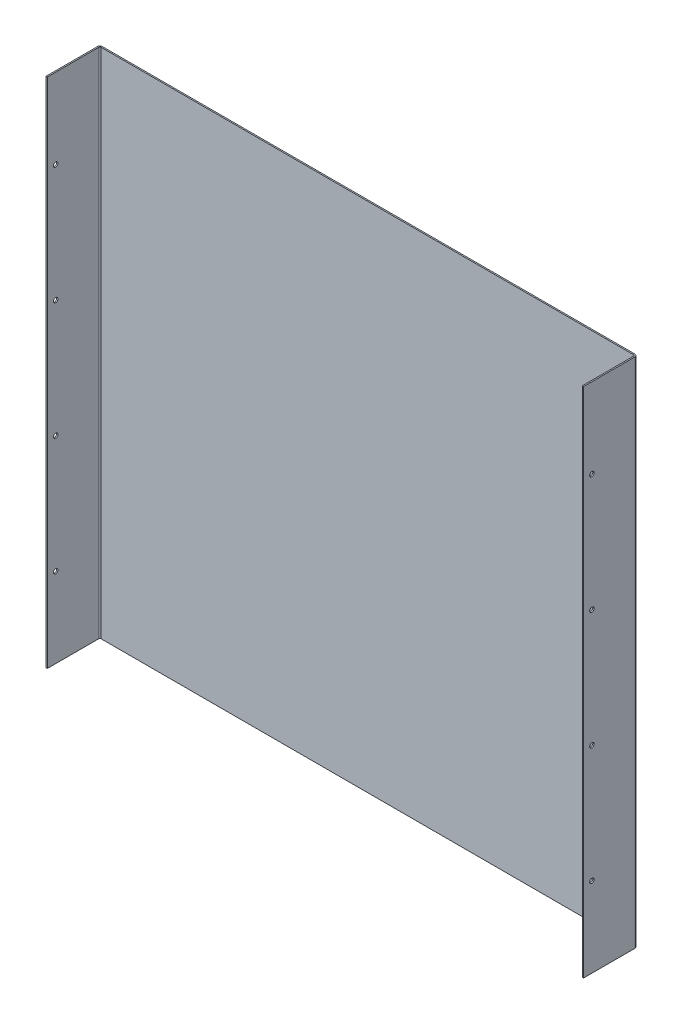
ISO-10303-21;
HEADER;
FILE_DESCRIPTION(('STEP AP214'),'2;1');
FILE_NAME('part.step','',(''),(''),'','','');
FILE_SCHEMA(('AUTOMOTIVE_DESIGN { 1 0 10303 214 1 1 1 1 }'));
ENDSEC;
DATA;
#1=APPLICATION_CONTEXT('core data for automotive mechanical design processes');
#2=APPLICATION_PROTOCOL_DEFINITION('international standard','automotive_design',2000,#1);
#3=PRODUCT_CONTEXT('',#1,'mechanical');
#4=PRODUCT('Part','Part','',(#3));
#5=PRODUCT_RELATED_PRODUCT_CATEGORY('part','',(#4));
#6=PRODUCT_DEFINITION_FORMATION('','',#4);
#7=PRODUCT_DEFINITION_CONTEXT('part definition',#1,'design');
#8=PRODUCT_DEFINITION('design','',#6,#7);
#9=PRODUCT_DEFINITION_SHAPE('','',#8);
#10=(LENGTH_UNIT() NAMED_UNIT(*) SI_UNIT(.MILLI.,.METRE.));
#11=(NAMED_UNIT(*) PLANE_ANGLE_UNIT() SI_UNIT($,.RADIAN.));
#12=(NAMED_UNIT(*) SI_UNIT($,.STERADIAN.) SOLID_ANGLE_UNIT());
#13=UNCERTAINTY_MEASURE_WITH_UNIT(LENGTH_MEASURE(1.E-05),#10,'distance_accuracy_value','');
#14=(GEOMETRIC_REPRESENTATION_CONTEXT(3) GLOBAL_UNCERTAINTY_ASSIGNED_CONTEXT((#13)) GLOBAL_UNIT_ASSIGNED_CONTEXT((#10,
#11,#12)) REPRESENTATION_CONTEXT('',''));
#15=CARTESIAN_POINT('',(0.,0.,0.));
#16=DIRECTION('',(0.,0.,1.));
#17=DIRECTION('',(1.,0.,0.));
#18=AXIS2_PLACEMENT_3D('',#15,#16,#17);
#19=CARTESIAN_POINT('',(418.7,0.,42.));
#20=DIRECTION('',(0.,0.,1.));
#21=DIRECTION('',(0.,1.,0.));
#22=AXIS2_PLACEMENT_3D('',#19,#20,#21);
#23=PLANE('',#22);
#24=DIRECTION('',(-1.,0.,0.));
#25=VECTOR('',#24,1.);
#26=CARTESIAN_POINT('',(418.7,0.,42.));
#27=LINE('',#26,#25);
#28=CARTESIAN_POINT('',(419.7,0.,42.));
#29=VERTEX_POINT('',#28);
#30=CARTESIAN_POINT('',(418.7,0.,42.));
#31=VERTEX_POINT('',#30);
#32=EDGE_CURVE('E11',#29,#31,#27,.T.);
#33=ORIENTED_EDGE('',*,*,#32,.F.);
#34=DIRECTION('',(0.,1.,0.));
#35=VECTOR('',#34,1.);
#36=CARTESIAN_POINT('',(419.7,0.,42.));
#37=LINE('',#36,#35);
#38=CARTESIAN_POINT('',(419.7,400.,42.));
#39=VERTEX_POINT('',#38);
#40=EDGE_CURVE('E98',#29,#39,#37,.T.);
#41=ORIENTED_EDGE('',*,*,#40,.T.);
#42=DIRECTION('',(-1.,0.,0.));
#43=VECTOR('',#42,1.);
#44=CARTESIAN_POINT('',(418.7,400.,42.));
#45=LINE('',#44,#43);
#46=CARTESIAN_POINT('',(418.7,400.,42.));
#47=VERTEX_POINT('',#46);
#48=EDGE_CURVE('E48',#39,#47,#45,.T.);
#49=ORIENTED_EDGE('',*,*,#48,.T.);
#50=DIRECTION('',(0.,1.,0.));
#51=VECTOR('',#50,1.);
#52=CARTESIAN_POINT('',(418.7,0.,42.));
#53=LINE('',#52,#51);
#54=EDGE_CURVE('E101',#31,#47,#53,.T.);
#55=ORIENTED_EDGE('',*,*,#54,.F.);
#56=EDGE_LOOP('',(#33,#41,#49,#55));
#57=FACE_BOUND('',#56,.T.);
#58=ADVANCED_FACE('F38',(#57),#23,.T.);
#59=CARTESIAN_POINT('',(418.7,400.,0.));
#60=DIRECTION('',(0.,-1.,0.));
#61=DIRECTION('',(0.,0.,1.));
#62=AXIS2_PLACEMENT_3D('',#59,#60,#61);
#63=PLANE('',#62);
#64=ORIENTED_EDGE('',*,*,#48,.F.);
#65=DIRECTION('',(0.,0.,1.));
#66=VECTOR('',#65,1.);
#67=CARTESIAN_POINT('',(419.7,400.,0.));
#68=LINE('',#67,#66);
#69=CARTESIAN_POINT('',(419.7,400.,2.));
#70=VERTEX_POINT('',#69);
#71=EDGE_CURVE('E113',#39,#70,#68,.F.);
#72=ORIENTED_EDGE('',*,*,#71,.T.);
#73=DIRECTION('',(-1.,0.,0.));
#74=VECTOR('',#73,1.);
#75=CARTESIAN_POINT('',(418.7,400.,2.));
#76=LINE('',#75,#74);
#77=CARTESIAN_POINT('',(418.7,400.,2.));
#78=VERTEX_POINT('',#77);
#79=EDGE_CURVE('E170',#70,#78,#76,.T.);
#80=ORIENTED_EDGE('',*,*,#79,.T.);
#81=DIRECTION('',(0.,0.,1.));
#82=VECTOR('',#81,1.);
#83=CARTESIAN_POINT('',(418.7,400.,0.));
#84=LINE('',#83,#82);
#85=EDGE_CURVE('E178',#47,#78,#84,.F.);
#86=ORIENTED_EDGE('',*,*,#85,.F.);
#87=EDGE_LOOP('',(#64,#72,#80,#86));
#88=FACE_BOUND('',#87,.T.);
#89=ADVANCED_FACE('F182',(#88),#63,.F.);
#90=CARTESIAN_POINT('',(417.7,400.,2.00000000000001));
#91=DIRECTION('',(0.,-1.,0.));
#92=DIRECTION('',(0.,0.,-1.));
#93=AXIS2_PLACEMENT_3D('',#90,#91,#92);
#94=PLANE('',#93);
#95=ORIENTED_EDGE('',*,*,#79,.F.);
#96=CARTESIAN_POINT('',(417.7,400.,2.00000000000001));
#97=DIRECTION('',(0.,1.,0.));
#98=DIRECTION('',(0.,0.,1.));
#99=AXIS2_PLACEMENT_3D('',#96,#97,#98);
#100=CIRCLE('',#99,2.);
#101=CARTESIAN_POINT('',(417.7,400.,0.));
#102=VERTEX_POINT('',#101);
#103=EDGE_CURVE('E211',#70,#102,#100,.T.);
#104=ORIENTED_EDGE('',*,*,#103,.T.);
#105=DIRECTION('',(0.,0.,1.));
#106=VECTOR('',#105,1.);
#107=CARTESIAN_POINT('',(417.7,400.,1.00000000000001));
#108=LINE('',#107,#106);
#109=CARTESIAN_POINT('',(417.7,400.,1.00000000000001));
#110=VERTEX_POINT('',#109);
#111=EDGE_CURVE('E167',#102,#110,#108,.T.);
#112=ORIENTED_EDGE('',*,*,#111,.T.);
#113=CARTESIAN_POINT('',(417.7,400.,2.00000000000001));
#114=DIRECTION('',(0.,1.,0.));
#115=DIRECTION('',(0.,0.,1.));
#116=AXIS2_PLACEMENT_3D('',#113,#114,#115);
#117=CIRCLE('',#116,1.);
#118=EDGE_CURVE('E190',#78,#110,#117,.T.);
#119=ORIENTED_EDGE('',*,*,#118,.F.);
#120=EDGE_LOOP('',(#95,#104,#112,#119));
#121=FACE_BOUND('',#120,.T.);
#122=ADVANCED_FACE('F234',(#121),#94,.F.);
#123=CARTESIAN_POINT('',(0.,400.,1.));
#124=DIRECTION('',(0.,-1.,0.));
#125=DIRECTION('',(-1.,0.,0.));
#126=AXIS2_PLACEMENT_3D('',#123,#124,#125);
#127=PLANE('',#126);
#128=ORIENTED_EDGE('',*,*,#111,.F.);
#129=DIRECTION('',(-1.,0.,0.));
#130=VECTOR('',#129,1.);
#131=CARTESIAN_POINT('',(0.,400.,0.));
#132=LINE('',#131,#130);
#133=CARTESIAN_POINT('',(2.,400.,0.));
#134=VERTEX_POINT('',#133);
#135=EDGE_CURVE('E204',#134,#102,#132,.F.);
#136=ORIENTED_EDGE('',*,*,#135,.F.);
#137=DIRECTION('',(0.,0.,1.));
#138=VECTOR('',#137,1.);
#139=CARTESIAN_POINT('',(2.,400.,1.));
#140=LINE('',#139,#138);
#141=CARTESIAN_POINT('',(2.,400.,1.));
#142=VERTEX_POINT('',#141);
#143=EDGE_CURVE('E164',#134,#142,#140,.T.);
#144=ORIENTED_EDGE('',*,*,#143,.T.);
#145=DIRECTION('',(-1.,0.,0.));
#146=VECTOR('',#145,1.);
#147=CARTESIAN_POINT('',(0.,400.,1.));
#148=LINE('',#147,#146);
#149=EDGE_CURVE('E270',#142,#110,#148,.F.);
#150=ORIENTED_EDGE('',*,*,#149,.T.);
#151=EDGE_LOOP('',(#128,#136,#144,#150));
#152=FACE_BOUND('',#151,.T.);
#153=ADVANCED_FACE('F334',(#152),#127,.F.);
#154=CARTESIAN_POINT('',(2.,400.,2.));
#155=DIRECTION('',(0.,1.,0.));
#156=DIRECTION('',(0.,0.,1.));
#157=AXIS2_PLACEMENT_3D('',#154,#155,#156);
#158=PLANE('',#157);
#159=ORIENTED_EDGE('',*,*,#143,.F.);
#160=CARTESIAN_POINT('',(2.,400.,2.));
#161=DIRECTION('',(0.,-1.,0.));
#162=DIRECTION('',(0.,0.,-1.));
#163=AXIS2_PLACEMENT_3D('',#160,#161,#162);
#164=CIRCLE('',#163,2.);
#165=CARTESIAN_POINT('',(0.,400.,1.99999999999999));
#166=VERTEX_POINT('',#165);
#167=EDGE_CURVE('E199',#166,#134,#164,.T.);
#168=ORIENTED_EDGE('',*,*,#167,.F.);
#169=DIRECTION('',(1.,0.,0.));
#170=VECTOR('',#169,1.);
#171=CARTESIAN_POINT('',(0.999999999999997,400.,1.99999999999999));
#172=LINE('',#171,#170);
#173=CARTESIAN_POINT('',(0.999999999999997,400.,1.99999999999999));
#174=VERTEX_POINT('',#173);
#175=EDGE_CURVE('E161',#166,#174,#172,.T.);
#176=ORIENTED_EDGE('',*,*,#175,.T.);
#177=CARTESIAN_POINT('',(2.,400.,2.));
#178=DIRECTION('',(0.,-1.,0.));
#179=DIRECTION('',(0.,0.,-1.));
#180=AXIS2_PLACEMENT_3D('',#177,#178,#179);
#181=CIRCLE('',#180,1.);
#182=EDGE_CURVE('E260',#174,#142,#181,.T.);
#183=ORIENTED_EDGE('',*,*,#182,.T.);
#184=EDGE_LOOP('',(#159,#168,#176,#183));
#185=FACE_BOUND('',#184,.T.);
#186=ADVANCED_FACE('F326',(#185),#158,.T.);
#187=CARTESIAN_POINT('',(1.,400.,0.));
#188=DIRECTION('',(0.,-1.,0.));
#189=DIRECTION('',(0.,0.,-1.));
#190=AXIS2_PLACEMENT_3D('',#187,#188,#189);
#191=PLANE('',#190);
#192=ORIENTED_EDGE('',*,*,#175,.F.);
#193=DIRECTION('',(0.,0.,-1.));
#194=VECTOR('',#193,1.);
#195=CARTESIAN_POINT('',(0.,400.,0.));
#196=LINE('',#195,#194);
#197=CARTESIAN_POINT('',(-1.46642216231411E-13,400.,42.));
#198=VERTEX_POINT('',#197);
#199=EDGE_CURVE('E145',#166,#198,#196,.F.);
#200=ORIENTED_EDGE('',*,*,#199,.T.);
#201=DIRECTION('',(1.,0.,0.));
#202=VECTOR('',#201,1.);
#203=CARTESIAN_POINT('',(0.999999999999926,400.,42.));
#204=LINE('',#203,#202);
#205=CARTESIAN_POINT('',(0.999999999999926,400.,42.));
#206=VERTEX_POINT('',#205);
#207=EDGE_CURVE('E158',#198,#206,#204,.T.);
#208=ORIENTED_EDGE('',*,*,#207,.T.);
#209=DIRECTION('',(0.,0.,-1.));
#210=VECTOR('',#209,1.);
#211=CARTESIAN_POINT('',(1.,400.,0.));
#212=LINE('',#211,#210);
#213=EDGE_CURVE('E281',#174,#206,#212,.F.);
#214=ORIENTED_EDGE('',*,*,#213,.F.);
#215=EDGE_LOOP('',(#192,#200,#208,#214));
#216=FACE_BOUND('',#215,.T.);
#217=ADVANCED_FACE('F354',(#216),#191,.F.);
#218=CARTESIAN_POINT('',(0.999999999999853,0.,42.));
#219=DIRECTION('',(0.,0.,-1.));
#220=DIRECTION('',(0.,1.,0.));
#221=AXIS2_PLACEMENT_3D('',#218,#219,#220);
#222=PLANE('',#221);
#223=ORIENTED_EDGE('',*,*,#207,.F.);
#224=DIRECTION('',(0.,1.,0.));
#225=VECTOR('',#224,1.);
#226=CARTESIAN_POINT('',(-1.46642216231411E-13,0.,42.));
#227=LINE('',#226,#225);
#228=CARTESIAN_POINT('',(-1.46642216231411E-13,0.,42.));
#229=VERTEX_POINT('',#228);
#230=EDGE_CURVE('E218',#198,#229,#227,.F.);
#231=ORIENTED_EDGE('',*,*,#230,.T.);
#232=DIRECTION('',(1.,0.,0.));
#233=VECTOR('',#232,1.);
#234=CARTESIAN_POINT('',(0.999999999999856,0.,42.));
#235=LINE('',#234,#233);
#236=CARTESIAN_POINT('',(0.999999999999856,0.,42.));
#237=VERTEX_POINT('',#236);
#238=EDGE_CURVE('E155',#229,#237,#235,.T.);
#239=ORIENTED_EDGE('',*,*,#238,.T.);
#240=DIRECTION('',(0.,1.,0.));
#241=VECTOR('',#240,1.);
#242=CARTESIAN_POINT('',(0.999999999999853,0.,42.));
#243=LINE('',#242,#241);
#244=EDGE_CURVE('E278',#206,#237,#243,.F.);
#245=ORIENTED_EDGE('',*,*,#244,.F.);
#246=EDGE_LOOP('',(#223,#231,#239,#245));
#247=FACE_BOUND('',#246,.T.);
#248=ADVANCED_FACE('F349',(#247),#222,.F.);
#249=CARTESIAN_POINT('',(1.,0.,0.));
#250=DIRECTION('',(0.,-1.,0.));
#251=DIRECTION('',(0.,0.,-1.));
#252=AXIS2_PLACEMENT_3D('',#249,#250,#251);
#253=PLANE('',#252);
#254=ORIENTED_EDGE('',*,*,#238,.F.);
#255=DIRECTION('',(0.,0.,-1.));
#256=VECTOR('',#255,1.);
#257=CARTESIAN_POINT('',(0.,0.,0.));
#258=LINE('',#257,#256);
#259=CARTESIAN_POINT('',(0.,0.,2.));
#260=VERTEX_POINT('',#259);
#261=EDGE_CURVE('E208',#229,#260,#258,.T.);
#262=ORIENTED_EDGE('',*,*,#261,.T.);
#263=DIRECTION('',(1.,0.,0.));
#264=VECTOR('',#263,1.);
#265=CARTESIAN_POINT('',(0.999999999999997,0.,2.));
#266=LINE('',#265,#264);
#267=CARTESIAN_POINT('',(0.999999999999997,0.,2.));
#268=VERTEX_POINT('',#267);
#269=EDGE_CURVE('E152',#260,#268,#266,.T.);
#270=ORIENTED_EDGE('',*,*,#269,.T.);
#271=DIRECTION('',(0.,0.,-1.));
#272=VECTOR('',#271,1.);
#273=CARTESIAN_POINT('',(1.,0.,0.));
#274=LINE('',#273,#272);
#275=EDGE_CURVE('E275',#237,#268,#274,.T.);
#276=ORIENTED_EDGE('',*,*,#275,.F.);
#277=EDGE_LOOP('',(#254,#262,#270,#276));
#278=FACE_BOUND('',#277,.T.);
#279=ADVANCED_FACE('F345',(#278),#253,.T.);
#280=CARTESIAN_POINT('',(2.,0.,2.));
#281=DIRECTION('',(0.,1.,0.));
#282=DIRECTION('',(0.,0.,1.));
#283=AXIS2_PLACEMENT_3D('',#280,#281,#282);
#284=PLANE('',#283);
#285=ORIENTED_EDGE('',*,*,#269,.F.);
#286=CARTESIAN_POINT('',(2.,0.,2.));
#287=DIRECTION('',(0.,-1.,0.));
#288=DIRECTION('',(0.,0.,-1.));
#289=AXIS2_PLACEMENT_3D('',#286,#287,#288);
#290=CIRCLE('',#289,2.);
#291=CARTESIAN_POINT('',(2.,0.,0.));
#292=VERTEX_POINT('',#291);
#293=EDGE_CURVE('E128',#260,#292,#290,.T.);
#294=ORIENTED_EDGE('',*,*,#293,.T.);
#295=DIRECTION('',(0.,0.,1.));
#296=VECTOR('',#295,1.);
#297=CARTESIAN_POINT('',(2.,0.,1.));
#298=LINE('',#297,#296);
#299=CARTESIAN_POINT('',(2.,0.,1.));
#300=VERTEX_POINT('',#299);
#301=EDGE_CURVE('E149',#292,#300,#298,.T.);
#302=ORIENTED_EDGE('',*,*,#301,.T.);
#303=CARTESIAN_POINT('',(2.,0.,2.));
#304=DIRECTION('',(0.,-1.,0.));
#305=DIRECTION('',(0.,0.,-1.));
#306=AXIS2_PLACEMENT_3D('',#303,#304,#305);
#307=CIRCLE('',#306,1.);
#308=EDGE_CURVE('E257',#268,#300,#307,.T.);
#309=ORIENTED_EDGE('',*,*,#308,.F.);
#310=EDGE_LOOP('',(#285,#294,#302,#309));
#311=FACE_BOUND('',#310,.T.);
#312=ADVANCED_FACE('F341',(#311),#284,.F.);
#313=CARTESIAN_POINT('',(0.,0.,1.));
#314=DIRECTION('',(0.,-1.,0.));
#315=DIRECTION('',(-1.,0.,0.));
#316=AXIS2_PLACEMENT_3D('',#313,#314,#315);
#317=PLANE('',#316);
#318=ORIENTED_EDGE('',*,*,#301,.F.);
#319=DIRECTION('',(-1.,0.,0.));
#320=VECTOR('',#319,1.);
#321=CARTESIAN_POINT('',(0.,0.,0.));
#322=LINE('',#321,#320);
#323=CARTESIAN_POINT('',(417.7,0.,0.));
#324=VERTEX_POINT('',#323);
#325=EDGE_CURVE('E200',#324,#292,#322,.T.);
#326=ORIENTED_EDGE('',*,*,#325,.F.);
#327=DIRECTION('',(0.,0.,1.));
#328=VECTOR('',#327,1.);
#329=CARTESIAN_POINT('',(417.7,0.,1.00000000000001));
#330=LINE('',#329,#328);
#331=CARTESIAN_POINT('',(417.7,0.,1.00000000000001));
#332=VERTEX_POINT('',#331);
#333=EDGE_CURVE('E146',#324,#332,#330,.T.);
#334=ORIENTED_EDGE('',*,*,#333,.T.);
#335=DIRECTION('',(-1.,0.,0.));
#336=VECTOR('',#335,1.);
#337=CARTESIAN_POINT('',(0.,0.,1.));
#338=LINE('',#337,#336);
#339=EDGE_CURVE('E264',#332,#300,#338,.T.);
#340=ORIENTED_EDGE('',*,*,#339,.T.);
#341=EDGE_LOOP('',(#318,#326,#334,#340));
#342=FACE_BOUND('',#341,.T.);
#343=ADVANCED_FACE('F369',(#342),#317,.T.);
#344=CARTESIAN_POINT('',(417.7,0.,2.00000000000001));
#345=DIRECTION('',(0.,-1.,0.));
#346=DIRECTION('',(0.,0.,-1.));
#347=AXIS2_PLACEMENT_3D('',#344,#345,#346);
#348=PLANE('',#347);
#349=ORIENTED_EDGE('',*,*,#333,.F.);
#350=CARTESIAN_POINT('',(417.7,0.,2.00000000000001));
#351=DIRECTION('',(0.,1.,0.));
#352=DIRECTION('',(0.,0.,1.));
#353=AXIS2_PLACEMENT_3D('',#350,#351,#352);
#354=CIRCLE('',#353,2.);
#355=CARTESIAN_POINT('',(419.7,0.,2.));
#356=VERTEX_POINT('',#355);
#357=EDGE_CURVE('E195',#356,#324,#354,.T.);
#358=ORIENTED_EDGE('',*,*,#357,.F.);
#359=DIRECTION('',(-1.,0.,0.));
#360=VECTOR('',#359,1.);
#361=CARTESIAN_POINT('',(418.7,0.,2.));
#362=LINE('',#361,#360);
#363=CARTESIAN_POINT('',(418.7,0.,2.));
#364=VERTEX_POINT('',#363);
#365=EDGE_CURVE('E42',#356,#364,#362,.T.);
#366=ORIENTED_EDGE('',*,*,#365,.T.);
#367=CARTESIAN_POINT('',(417.7,0.,2.00000000000001));
#368=DIRECTION('',(0.,1.,0.));
#369=DIRECTION('',(0.,0.,1.));
#370=AXIS2_PLACEMENT_3D('',#367,#368,#369);
#371=CIRCLE('',#370,1.);
#372=EDGE_CURVE('E185',#364,#332,#371,.T.);
#373=ORIENTED_EDGE('',*,*,#372,.T.);
#374=EDGE_LOOP('',(#349,#358,#366,#373));
#375=FACE_BOUND('',#374,.T.);
#376=ADVANCED_FACE('F303',(#375),#348,.T.);
#377=CARTESIAN_POINT('',(0.999999999999892,337.5,35.500000000002));
#378=DIRECTION('',(1.,0.,0.));
#379=DIRECTION('',(0.,0.,-1.));
#380=AXIS2_PLACEMENT_3D('',#377,#378,#379);
#381=CYLINDRICAL_SURFACE('',#380,1.75);
#382=CARTESIAN_POINT('',(0.999999999999892,337.5,35.500000000002));
#383=DIRECTION('',(1.,0.,0.));
#384=DIRECTION('',(0.,0.,-1.));
#385=AXIS2_PLACEMENT_3D('',#382,#383,#384);
#386=CIRCLE('',#385,1.75);
#387=CARTESIAN_POINT('',(0.999999999999886,337.5,33.750000000002));
#388=VERTEX_POINT('',#387);
#389=EDGE_CURVE('E228',#388,#388,#386,.F.);
#390=ORIENTED_EDGE('',*,*,#389,.F.);
#391=EDGE_LOOP('',(#390));
#392=FACE_BOUND('',#391,.T.);
#393=CARTESIAN_POINT('',(-1.08203376814053E-13,337.5,35.500000000002));
#394=DIRECTION('',(1.,0.,0.));
#395=DIRECTION('',(0.,0.,-1.));
#396=AXIS2_PLACEMENT_3D('',#393,#394,#395);
#397=CIRCLE('',#396,1.75);
#398=CARTESIAN_POINT('',(-1.14149483296361E-13,337.5,33.750000000002));
#399=VERTEX_POINT('',#398);
#400=EDGE_CURVE('E133',#399,#399,#397,.F.);
#401=ORIENTED_EDGE('',*,*,#400,.T.);
#402=EDGE_LOOP('',(#401));
#403=FACE_BOUND('',#402,.T.);
#404=ADVANCED_FACE('F299',(#392,#403),#381,.F.);
#405=CARTESIAN_POINT('',(0.999999999999892,245.8,35.500000000002));
#406=DIRECTION('',(1.,0.,0.));
#407=DIRECTION('',(0.,0.,-1.));
#408=AXIS2_PLACEMENT_3D('',#405,#406,#407);
#409=CYLINDRICAL_SURFACE('',#408,1.75);
#410=CARTESIAN_POINT('',(0.999999999999892,245.8,35.500000000002));
#411=DIRECTION('',(1.,0.,0.));
#412=DIRECTION('',(0.,0.,-1.));
#413=AXIS2_PLACEMENT_3D('',#410,#411,#412);
#414=CIRCLE('',#413,1.75);
#415=CARTESIAN_POINT('',(0.999999999999886,245.8,33.750000000002));
#416=VERTEX_POINT('',#415);
#417=EDGE_CURVE('E290',#416,#416,#414,.F.);
#418=ORIENTED_EDGE('',*,*,#417,.F.);
#419=EDGE_LOOP('',(#418));
#420=FACE_BOUND('',#419,.T.);
#421=CARTESIAN_POINT('',(-1.08203376814053E-13,245.8,35.500000000002));
#422=DIRECTION('',(1.,0.,0.));
#423=DIRECTION('',(0.,0.,-1.));
#424=AXIS2_PLACEMENT_3D('',#421,#422,#423);
#425=CIRCLE('',#424,1.75);
#426=CARTESIAN_POINT('',(-1.14149483296361E-13,245.8,33.750000000002));
#427=VERTEX_POINT('',#426);
#428=EDGE_CURVE('E136',#427,#427,#425,.F.);
#429=ORIENTED_EDGE('',*,*,#428,.T.);
#430=EDGE_LOOP('',(#429));
#431=FACE_BOUND('',#430,.T.);
#432=ADVANCED_FACE('F302',(#420,#431),#409,.F.);
#433=CARTESIAN_POINT('',(0.999999999999892,154.2,35.500000000002));
#434=DIRECTION('',(1.,0.,0.));
#435=DIRECTION('',(0.,0.,-1.));
#436=AXIS2_PLACEMENT_3D('',#433,#434,#435);
#437=CYLINDRICAL_SURFACE('',#436,1.75);
#438=CARTESIAN_POINT('',(0.999999999999892,154.2,35.500000000002));
#439=DIRECTION('',(1.,0.,0.));
#440=DIRECTION('',(0.,0.,-1.));
#441=AXIS2_PLACEMENT_3D('',#438,#439,#440);
#442=CIRCLE('',#441,1.75);
#443=CARTESIAN_POINT('',(0.999999999999886,154.2,33.750000000002));
#444=VERTEX_POINT('',#443);
#445=EDGE_CURVE('E287',#444,#444,#442,.F.);
#446=ORIENTED_EDGE('',*,*,#445,.F.);
#447=EDGE_LOOP('',(#446));
#448=FACE_BOUND('',#447,.T.);
#449=CARTESIAN_POINT('',(-1.08203376814053E-13,154.2,35.500000000002));
#450=DIRECTION('',(1.,0.,0.));
#451=DIRECTION('',(0.,0.,-1.));
#452=AXIS2_PLACEMENT_3D('',#449,#450,#451);
#453=CIRCLE('',#452,1.75);
#454=CARTESIAN_POINT('',(-1.14149483296361E-13,154.2,33.750000000002));
#455=VERTEX_POINT('',#454);
#456=EDGE_CURVE('E139',#455,#455,#453,.F.);
#457=ORIENTED_EDGE('',*,*,#456,.T.);
#458=EDGE_LOOP('',(#457));
#459=FACE_BOUND('',#458,.T.);
#460=ADVANCED_FACE('F408',(#448,#459),#437,.F.);
#461=CARTESIAN_POINT('',(0.999999999999892,62.4999999999999,35.500000000002));
#462=DIRECTION('',(1.,0.,0.));
#463=DIRECTION('',(0.,0.,-1.));
#464=AXIS2_PLACEMENT_3D('',#461,#462,#463);
#465=CYLINDRICAL_SURFACE('',#464,1.75);
#466=CARTESIAN_POINT('',(0.999999999999892,62.4999999999999,35.500000000002));
#467=DIRECTION('',(1.,0.,0.));
#468=DIRECTION('',(0.,0.,-1.));
#469=AXIS2_PLACEMENT_3D('',#466,#467,#468);
#470=CIRCLE('',#469,1.75);
#471=CARTESIAN_POINT('',(0.999999999999886,62.4999999999999,33.750000000002));
#472=VERTEX_POINT('',#471);
#473=EDGE_CURVE('E284',#472,#472,#470,.F.);
#474=ORIENTED_EDGE('',*,*,#473,.F.);
#475=EDGE_LOOP('',(#474));
#476=FACE_BOUND('',#475,.T.);
#477=CARTESIAN_POINT('',(-1.08203376814053E-13,62.4999999999999,35.500000000002));
#478=DIRECTION('',(1.,0.,0.));
#479=DIRECTION('',(0.,0.,-1.));
#480=AXIS2_PLACEMENT_3D('',#477,#478,#479);
#481=CIRCLE('',#480,1.75);
#482=CARTESIAN_POINT('',(-1.14149483296361E-13,62.4999999999999,33.750000000002));
#483=VERTEX_POINT('',#482);
#484=EDGE_CURVE('E142',#483,#483,#481,.F.);
#485=ORIENTED_EDGE('',*,*,#484,.T.);
#486=EDGE_LOOP('',(#485));
#487=FACE_BOUND('',#486,.T.);
#488=ADVANCED_FACE('F40',(#476,#487),#465,.F.);
#489=CARTESIAN_POINT('',(418.7,337.5,35.5000000000006));
#490=DIRECTION('',(1.,0.,0.));
#491=DIRECTION('',(0.,0.,-1.));
#492=AXIS2_PLACEMENT_3D('',#489,#490,#491);
#493=CYLINDRICAL_SURFACE('',#492,1.75);
#494=CARTESIAN_POINT('',(418.7,337.5,35.5000000000006));
#495=DIRECTION('',(1.,0.,0.));
#496=DIRECTION('',(0.,0.,-1.));
#497=AXIS2_PLACEMENT_3D('',#494,#495,#496);
#498=CIRCLE('',#497,1.75);
#499=CARTESIAN_POINT('',(418.7,337.5,33.7500000000006));
#500=VERTEX_POINT('',#499);
#501=EDGE_CURVE('E254',#500,#500,#498,.T.);
#502=ORIENTED_EDGE('',*,*,#501,.F.);
#503=EDGE_LOOP('',(#502));
#504=FACE_BOUND('',#503,.T.);
#505=CARTESIAN_POINT('',(419.7,337.5,35.5000000000006));
#506=DIRECTION('',(1.,0.,0.));
#507=DIRECTION('',(0.,0.,-1.));
#508=AXIS2_PLACEMENT_3D('',#505,#506,#507);
#509=CIRCLE('',#508,1.75);
#510=CARTESIAN_POINT('',(419.7,337.5,33.7500000000006));
#511=VERTEX_POINT('',#510);
#512=EDGE_CURVE('E124',#511,#511,#509,.T.);
#513=ORIENTED_EDGE('',*,*,#512,.T.);
#514=EDGE_LOOP('',(#513));
#515=FACE_BOUND('',#514,.T.);
#516=ADVANCED_FACE('F392',(#504,#515),#493,.F.);
#517=CARTESIAN_POINT('',(418.7,245.8,35.5000000000006));
#518=DIRECTION('',(1.,0.,0.));
#519=DIRECTION('',(0.,0.,-1.));
#520=AXIS2_PLACEMENT_3D('',#517,#518,#519);
#521=CYLINDRICAL_SURFACE('',#520,1.75);
#522=CARTESIAN_POINT('',(418.7,245.8,35.5000000000006));
#523=DIRECTION('',(1.,0.,0.));
#524=DIRECTION('',(0.,0.,-1.));
#525=AXIS2_PLACEMENT_3D('',#522,#523,#524);
#526=CIRCLE('',#525,1.75);
#527=CARTESIAN_POINT('',(418.7,245.8,33.7500000000006));
#528=VERTEX_POINT('',#527);
#529=EDGE_CURVE('E251',#528,#528,#526,.T.);
#530=ORIENTED_EDGE('',*,*,#529,.F.);
#531=EDGE_LOOP('',(#530));
#532=FACE_BOUND('',#531,.T.);
#533=CARTESIAN_POINT('',(419.7,245.8,35.5000000000006));
#534=DIRECTION('',(1.,0.,0.));
#535=DIRECTION('',(0.,0.,-1.));
#536=AXIS2_PLACEMENT_3D('',#533,#534,#535);
#537=CIRCLE('',#536,1.75);
#538=CARTESIAN_POINT('',(419.7,245.8,33.7500000000006));
#539=VERTEX_POINT('',#538);
#540=EDGE_CURVE('E127',#539,#539,#537,.T.);
#541=ORIENTED_EDGE('',*,*,#540,.T.);
#542=EDGE_LOOP('',(#541));
#543=FACE_BOUND('',#542,.T.);
#544=ADVANCED_FACE('F395',(#532,#543),#521,.F.);
#545=CARTESIAN_POINT('',(418.7,154.2,35.5000000000006));
#546=DIRECTION('',(1.,0.,0.));
#547=DIRECTION('',(0.,0.,-1.));
#548=AXIS2_PLACEMENT_3D('',#545,#546,#547);
#549=CYLINDRICAL_SURFACE('',#548,1.75);
#550=CARTESIAN_POINT('',(418.7,154.2,35.5000000000006));
#551=DIRECTION('',(1.,0.,0.));
#552=DIRECTION('',(0.,0.,-1.));
#553=AXIS2_PLACEMENT_3D('',#550,#551,#552);
#554=CIRCLE('',#553,1.75);
#555=CARTESIAN_POINT('',(418.7,154.2,33.7500000000006));
#556=VERTEX_POINT('',#555);
#557=EDGE_CURVE('E246',#556,#556,#554,.T.);
#558=ORIENTED_EDGE('',*,*,#557,.F.);
#559=EDGE_LOOP('',(#558));
#560=FACE_BOUND('',#559,.T.);
#561=CARTESIAN_POINT('',(419.7,154.2,35.5000000000006));
#562=DIRECTION('',(1.,0.,0.));
#563=DIRECTION('',(0.,0.,-1.));
#564=AXIS2_PLACEMENT_3D('',#561,#562,#563);
#565=CIRCLE('',#564,1.75);
#566=CARTESIAN_POINT('',(419.7,154.2,33.7500000000006));
#567=VERTEX_POINT('',#566);
#568=EDGE_CURVE('E120',#567,#567,#565,.T.);
#569=ORIENTED_EDGE('',*,*,#568,.T.);
#570=EDGE_LOOP('',(#569));
#571=FACE_BOUND('',#570,.T.);
#572=ADVANCED_FACE('F399',(#560,#571),#549,.F.);
#573=CARTESIAN_POINT('',(418.7,62.4999999999999,35.5000000000006));
#574=DIRECTION('',(1.,0.,0.));
#575=DIRECTION('',(0.,0.,-1.));
#576=AXIS2_PLACEMENT_3D('',#573,#574,#575);
#577=CYLINDRICAL_SURFACE('',#576,1.75);
#578=CARTESIAN_POINT('',(418.7,62.4999999999999,35.5000000000006));
#579=DIRECTION('',(1.,0.,0.));
#580=DIRECTION('',(0.,0.,-1.));
#581=AXIS2_PLACEMENT_3D('',#578,#579,#580);
#582=CIRCLE('',#581,1.75);
#583=CARTESIAN_POINT('',(418.7,62.4999999999999,33.7500000000006));
#584=VERTEX_POINT('',#583);
#585=EDGE_CURVE('E244',#584,#584,#582,.T.);
#586=ORIENTED_EDGE('',*,*,#585,.F.);
#587=EDGE_LOOP('',(#586));
#588=FACE_BOUND('',#587,.T.);
#589=CARTESIAN_POINT('',(419.7,62.4999999999999,35.5000000000006));
#590=DIRECTION('',(1.,0.,0.));
#591=DIRECTION('',(0.,0.,-1.));
#592=AXIS2_PLACEMENT_3D('',#589,#590,#591);
#593=CIRCLE('',#592,1.75);
#594=CARTESIAN_POINT('',(419.7,62.4999999999999,33.7500000000006));
#595=VERTEX_POINT('',#594);
#596=EDGE_CURVE('E117',#595,#595,#593,.T.);
#597=ORIENTED_EDGE('',*,*,#596,.T.);
#598=EDGE_LOOP('',(#597));
#599=FACE_BOUND('',#598,.T.);
#600=ADVANCED_FACE('F391',(#588,#599),#577,.F.);
#601=CARTESIAN_POINT('',(418.7,0.,0.));
#602=DIRECTION('',(0.,-1.,0.));
#603=DIRECTION('',(0.,0.,1.));
#604=AXIS2_PLACEMENT_3D('',#601,#602,#603);
#605=PLANE('',#604);
#606=DIRECTION('',(0.,0.,1.));
#607=VECTOR('',#606,1.);
#608=CARTESIAN_POINT('',(419.7,0.,0.));
#609=LINE('',#608,#607);
#610=EDGE_CURVE('E111',#356,#29,#609,.T.);
#611=ORIENTED_EDGE('',*,*,#610,.T.);
#612=ORIENTED_EDGE('',*,*,#32,.T.);
#613=DIRECTION('',(0.,0.,1.));
#614=VECTOR('',#613,1.);
#615=CARTESIAN_POINT('',(418.7,0.,0.));
#616=LINE('',#615,#614);
#617=EDGE_CURVE('E180',#364,#31,#616,.T.);
#618=ORIENTED_EDGE('',*,*,#617,.F.);
#619=ORIENTED_EDGE('',*,*,#365,.F.);
#620=EDGE_LOOP('',(#611,#612,#618,#619));
#621=FACE_BOUND('',#620,.T.);
#622=ADVANCED_FACE('F115',(#621),#605,.T.);
#623=CARTESIAN_POINT('',(417.7,400.,2.00000000000001));
#624=DIRECTION('',(0.,1.,0.));
#625=DIRECTION('',(0.,0.,1.));
#626=AXIS2_PLACEMENT_3D('',#623,#624,#625);
#627=CYLINDRICAL_SURFACE('',#626,1.);
#628=ORIENTED_EDGE('',*,*,#372,.F.);
#629=DIRECTION('',(0.,1.,0.));
#630=VECTOR('',#629,1.);
#631=CARTESIAN_POINT('',(418.7,400.,2.));
#632=LINE('',#631,#630);
#633=EDGE_CURVE('E183',#78,#364,#632,.F.);
#634=ORIENTED_EDGE('',*,*,#633,.F.);
#635=ORIENTED_EDGE('',*,*,#118,.T.);
#636=DIRECTION('',(0.,1.,0.));
#637=VECTOR('',#636,1.);
#638=CARTESIAN_POINT('',(417.7,0.,1.));
#639=LINE('',#638,#637);
#640=EDGE_CURVE('E243',#110,#332,#639,.F.);
#641=ORIENTED_EDGE('',*,*,#640,.T.);
#642=EDGE_LOOP('',(#628,#634,#635,#641));
#643=FACE_BOUND('',#642,.T.);
#644=ADVANCED_FACE('F241',(#643),#627,.F.);
#645=CARTESIAN_POINT('',(418.7,0.,0.));
#646=DIRECTION('',(-1.,0.,0.));
#647=DIRECTION('',(0.,0.,1.));
#648=AXIS2_PLACEMENT_3D('',#645,#646,#647);
#649=PLANE('',#648);
#650=ORIENTED_EDGE('',*,*,#501,.T.);
#651=EDGE_LOOP('',(#650));
#652=FACE_BOUND('',#651,.T.);
#653=ORIENTED_EDGE('',*,*,#529,.T.);
#654=EDGE_LOOP('',(#653));
#655=FACE_BOUND('',#654,.T.);
#656=ORIENTED_EDGE('',*,*,#557,.T.);
#657=EDGE_LOOP('',(#656));
#658=FACE_BOUND('',#657,.T.);
#659=ORIENTED_EDGE('',*,*,#585,.T.);
#660=EDGE_LOOP('',(#659));
#661=FACE_BOUND('',#660,.T.);
#662=ORIENTED_EDGE('',*,*,#617,.T.);
#663=ORIENTED_EDGE('',*,*,#54,.T.);
#664=ORIENTED_EDGE('',*,*,#85,.T.);
#665=ORIENTED_EDGE('',*,*,#633,.T.);
#666=EDGE_LOOP('',(#662,#663,#664,#665));
#667=FACE_BOUND('',#666,.T.);
#668=ADVANCED_FACE('F176',(#652,#655,#658,#661,#667),#649,.T.);
#669=CARTESIAN_POINT('',(2.,0.,2.));
#670=DIRECTION('',(0.,-1.,0.));
#671=DIRECTION('',(0.,0.,-1.));
#672=AXIS2_PLACEMENT_3D('',#669,#670,#671);
#673=CYLINDRICAL_SURFACE('',#672,1.);
#674=ORIENTED_EDGE('',*,*,#182,.F.);
#675=DIRECTION('',(0.,-1.,0.));
#676=VECTOR('',#675,1.);
#677=CARTESIAN_POINT('',(1.,0.,2.));
#678=LINE('',#677,#676);
#679=EDGE_CURVE('E272',#268,#174,#678,.F.);
#680=ORIENTED_EDGE('',*,*,#679,.F.);
#681=ORIENTED_EDGE('',*,*,#308,.T.);
#682=DIRECTION('',(0.,1.,0.));
#683=VECTOR('',#682,1.);
#684=CARTESIAN_POINT('',(2.,0.,1.));
#685=LINE('',#684,#683);
#686=EDGE_CURVE('E267',#300,#142,#685,.T.);
#687=ORIENTED_EDGE('',*,*,#686,.T.);
#688=EDGE_LOOP('',(#674,#680,#681,#687));
#689=FACE_BOUND('',#688,.T.);
#690=ADVANCED_FACE('F360',(#689),#673,.F.);
#691=CARTESIAN_POINT('',(0.,0.,1.));
#692=DIRECTION('',(0.,0.,-1.));
#693=DIRECTION('',(-1.,0.,0.));
#694=AXIS2_PLACEMENT_3D('',#691,#692,#693);
#695=PLANE('',#694);
#696=ORIENTED_EDGE('',*,*,#149,.F.);
#697=ORIENTED_EDGE('',*,*,#686,.F.);
#698=ORIENTED_EDGE('',*,*,#339,.F.);
#699=ORIENTED_EDGE('',*,*,#640,.F.);
#700=EDGE_LOOP('',(#696,#697,#698,#699));
#701=FACE_BOUND('',#700,.T.);
#702=ADVANCED_FACE('F372',(#701),#695,.F.);
#703=CARTESIAN_POINT('',(1.,0.,0.));
#704=DIRECTION('',(1.,0.,0.));
#705=DIRECTION('',(0.,0.,-1.));
#706=AXIS2_PLACEMENT_3D('',#703,#704,#705);
#707=PLANE('',#706);
#708=ORIENTED_EDGE('',*,*,#389,.T.);
#709=EDGE_LOOP('',(#708));
#710=FACE_BOUND('',#709,.T.);
#711=ORIENTED_EDGE('',*,*,#417,.T.);
#712=EDGE_LOOP('',(#711));
#713=FACE_BOUND('',#712,.T.);
#714=ORIENTED_EDGE('',*,*,#445,.T.);
#715=EDGE_LOOP('',(#714));
#716=FACE_BOUND('',#715,.T.);
#717=ORIENTED_EDGE('',*,*,#473,.T.);
#718=EDGE_LOOP('',(#717));
#719=FACE_BOUND('',#718,.T.);
#720=ORIENTED_EDGE('',*,*,#213,.T.);
#721=ORIENTED_EDGE('',*,*,#244,.T.);
#722=ORIENTED_EDGE('',*,*,#275,.T.);
#723=ORIENTED_EDGE('',*,*,#679,.T.);
#724=EDGE_LOOP('',(#720,#721,#722,#723));
#725=FACE_BOUND('',#724,.T.);
#726=ADVANCED_FACE('F296',(#710,#713,#716,#719,#725),#707,.T.);
#727=CARTESIAN_POINT('',(417.7,400.,2.00000000000001));
#728=DIRECTION('',(0.,1.,0.));
#729=DIRECTION('',(0.,0.,1.));
#730=AXIS2_PLACEMENT_3D('',#727,#728,#729);
#731=CYLINDRICAL_SURFACE('',#730,2.);
#732=ORIENTED_EDGE('',*,*,#357,.T.);
#733=DIRECTION('',(0.,1.,0.));
#734=VECTOR('',#733,1.);
#735=CARTESIAN_POINT('',(417.7,400.,0.));
#736=LINE('',#735,#734);
#737=EDGE_CURVE('E196',#102,#324,#736,.F.);
#738=ORIENTED_EDGE('',*,*,#737,.F.);
#739=ORIENTED_EDGE('',*,*,#103,.F.);
#740=DIRECTION('',(0.,1.,0.));
#741=VECTOR('',#740,1.);
#742=CARTESIAN_POINT('',(419.7,0.,2.));
#743=LINE('',#742,#741);
#744=EDGE_CURVE('E193',#70,#356,#743,.F.);
#745=ORIENTED_EDGE('',*,*,#744,.T.);
#746=EDGE_LOOP('',(#732,#738,#739,#745));
#747=FACE_BOUND('',#746,.T.);
#748=ADVANCED_FACE('F232',(#747),#731,.T.);
#749=CARTESIAN_POINT('',(419.7,0.,0.));
#750=DIRECTION('',(-1.,0.,0.));
#751=DIRECTION('',(0.,0.,1.));
#752=AXIS2_PLACEMENT_3D('',#749,#750,#751);
#753=PLANE('',#752);
#754=ORIENTED_EDGE('',*,*,#512,.F.);
#755=EDGE_LOOP('',(#754));
#756=FACE_BOUND('',#755,.T.);
#757=ORIENTED_EDGE('',*,*,#540,.F.);
#758=EDGE_LOOP('',(#757));
#759=FACE_BOUND('',#758,.T.);
#760=ORIENTED_EDGE('',*,*,#568,.F.);
#761=EDGE_LOOP('',(#760));
#762=FACE_BOUND('',#761,.T.);
#763=ORIENTED_EDGE('',*,*,#596,.F.);
#764=EDGE_LOOP('',(#763));
#765=FACE_BOUND('',#764,.T.);
#766=ORIENTED_EDGE('',*,*,#610,.F.);
#767=ORIENTED_EDGE('',*,*,#744,.F.);
#768=ORIENTED_EDGE('',*,*,#71,.F.);
#769=ORIENTED_EDGE('',*,*,#40,.F.);
#770=EDGE_LOOP('',(#766,#767,#768,#769));
#771=FACE_BOUND('',#770,.T.);
#772=ADVANCED_FACE('F109',(#756,#759,#762,#765,#771),#753,.F.);
#773=CARTESIAN_POINT('',(2.,0.,2.));
#774=DIRECTION('',(0.,-1.,0.));
#775=DIRECTION('',(0.,0.,-1.));
#776=AXIS2_PLACEMENT_3D('',#773,#774,#775);
#777=CYLINDRICAL_SURFACE('',#776,2.);
#778=ORIENTED_EDGE('',*,*,#167,.T.);
#779=DIRECTION('',(0.,-1.,0.));
#780=VECTOR('',#779,1.);
#781=CARTESIAN_POINT('',(2.,0.,0.));
#782=LINE('',#781,#780);
#783=EDGE_CURVE('E201',#292,#134,#782,.F.);
#784=ORIENTED_EDGE('',*,*,#783,.F.);
#785=ORIENTED_EDGE('',*,*,#293,.F.);
#786=DIRECTION('',(0.,1.,0.));
#787=VECTOR('',#786,1.);
#788=CARTESIAN_POINT('',(0.,0.,2.));
#789=LINE('',#788,#787);
#790=EDGE_CURVE('E205',#260,#166,#789,.T.);
#791=ORIENTED_EDGE('',*,*,#790,.T.);
#792=EDGE_LOOP('',(#778,#784,#785,#791));
#793=FACE_BOUND('',#792,.T.);
#794=ADVANCED_FACE('F332',(#793),#777,.T.);
#795=CARTESIAN_POINT('',(0.,0.,0.));
#796=DIRECTION('',(0.,0.,-1.));
#797=DIRECTION('',(-1.,0.,0.));
#798=AXIS2_PLACEMENT_3D('',#795,#796,#797);
#799=PLANE('',#798);
#800=ORIENTED_EDGE('',*,*,#135,.T.);
#801=ORIENTED_EDGE('',*,*,#737,.T.);
#802=ORIENTED_EDGE('',*,*,#325,.T.);
#803=ORIENTED_EDGE('',*,*,#783,.T.);
#804=EDGE_LOOP('',(#800,#801,#802,#803));
#805=FACE_BOUND('',#804,.T.);
#806=ADVANCED_FACE('F310',(#805),#799,.T.);
#807=CARTESIAN_POINT('',(0.,0.,0.));
#808=DIRECTION('',(1.,0.,0.));
#809=DIRECTION('',(0.,0.,-1.));
#810=AXIS2_PLACEMENT_3D('',#807,#808,#809);
#811=PLANE('',#810);
#812=ORIENTED_EDGE('',*,*,#400,.F.);
#813=EDGE_LOOP('',(#812));
#814=FACE_BOUND('',#813,.T.);
#815=ORIENTED_EDGE('',*,*,#428,.F.);
#816=EDGE_LOOP('',(#815));
#817=FACE_BOUND('',#816,.T.);
#818=ORIENTED_EDGE('',*,*,#456,.F.);
#819=EDGE_LOOP('',(#818));
#820=FACE_BOUND('',#819,.T.);
#821=ORIENTED_EDGE('',*,*,#484,.F.);
#822=EDGE_LOOP('',(#821));
#823=FACE_BOUND('',#822,.T.);
#824=ORIENTED_EDGE('',*,*,#199,.F.);
#825=ORIENTED_EDGE('',*,*,#790,.F.);
#826=ORIENTED_EDGE('',*,*,#261,.F.);
#827=ORIENTED_EDGE('',*,*,#230,.F.);
#828=EDGE_LOOP('',(#824,#825,#826,#827));
#829=FACE_BOUND('',#828,.T.);
#830=ADVANCED_FACE('F307',(#814,#817,#820,#823,#829),#811,.F.);
#831=CLOSED_SHELL('',(#58,#89,#122,#153,#186,#217,#248,#279,#312,#343,#376,#404,#432,#460,#488,
#516,#544,#572,#600,#622,#644,#668,#690,#702,#726,#748,#772,#794,#806,#830));
#832=MANIFOLD_SOLID_BREP('B2',#831);
#833=ADVANCED_BREP_SHAPE_REPRESENTATION('',(#18,#832),#14);
#834=SHAPE_DEFINITION_REPRESENTATION(#9,#833);
ENDSEC;
END-ISO-10303-21;
